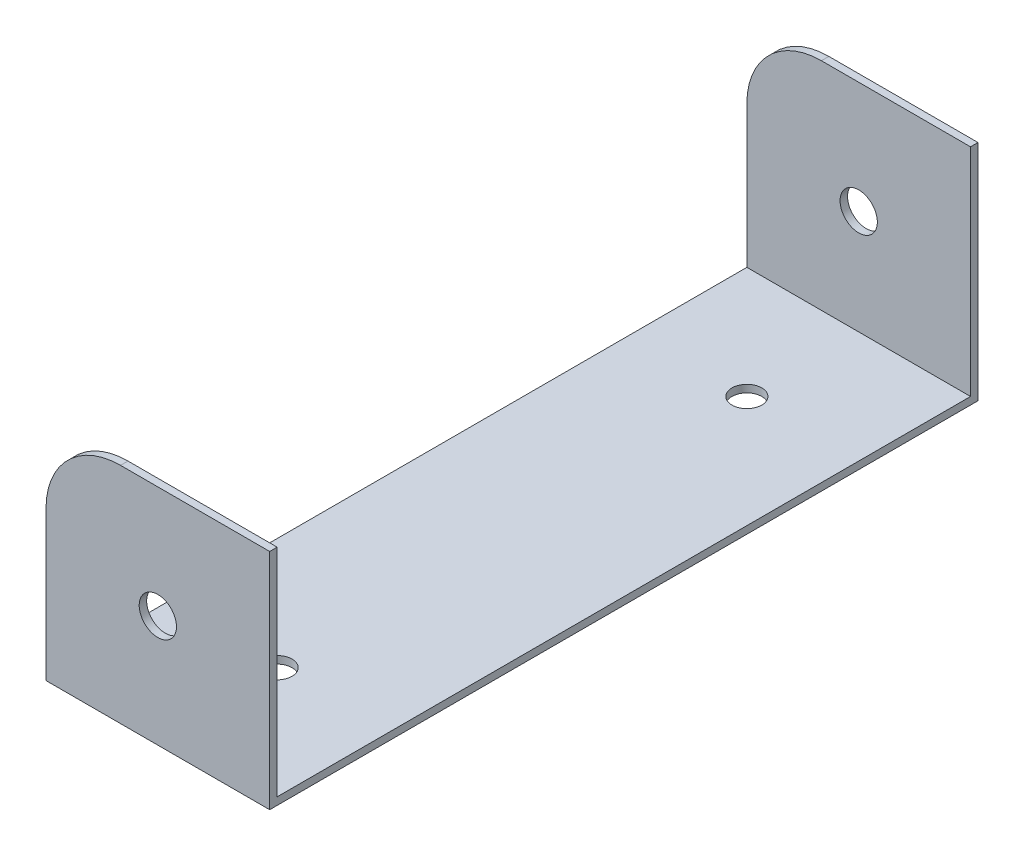
ISO-10303-21;
HEADER;
FILE_DESCRIPTION(('STEP AP214'),'2;1');
FILE_NAME('part.step','',(''),(''),'','','');
FILE_SCHEMA(('AUTOMOTIVE_DESIGN { 1 0 10303 214 1 1 1 1 }'));
ENDSEC;
DATA;
#1=APPLICATION_CONTEXT('core data for automotive mechanical design processes');
#2=APPLICATION_PROTOCOL_DEFINITION('international standard','automotive_design',2000,#1);
#3=PRODUCT_CONTEXT('',#1,'mechanical');
#4=PRODUCT('Part','Part','',(#3));
#5=PRODUCT_RELATED_PRODUCT_CATEGORY('part','',(#4));
#6=PRODUCT_DEFINITION_FORMATION('','',#4);
#7=PRODUCT_DEFINITION_CONTEXT('part definition',#1,'design');
#8=PRODUCT_DEFINITION('design','',#6,#7);
#9=PRODUCT_DEFINITION_SHAPE('','',#8);
#10=(LENGTH_UNIT() NAMED_UNIT(*) SI_UNIT(.MILLI.,.METRE.));
#11=(NAMED_UNIT(*) PLANE_ANGLE_UNIT() SI_UNIT($,.RADIAN.));
#12=(NAMED_UNIT(*) SI_UNIT($,.STERADIAN.) SOLID_ANGLE_UNIT());
#13=UNCERTAINTY_MEASURE_WITH_UNIT(LENGTH_MEASURE(1.E-05),#10,'distance_accuracy_value','');
#14=(GEOMETRIC_REPRESENTATION_CONTEXT(3) GLOBAL_UNCERTAINTY_ASSIGNED_CONTEXT((#13)) GLOBAL_UNIT_ASSIGNED_CONTEXT((#10,
#11,#12)) REPRESENTATION_CONTEXT('',''));
#15=CARTESIAN_POINT('',(0.,0.,0.));
#16=DIRECTION('',(0.,0.,1.));
#17=DIRECTION('',(1.,0.,0.));
#18=AXIS2_PLACEMENT_3D('',#15,#16,#17);
#19=CARTESIAN_POINT('',(0.,1.,0.));
#20=DIRECTION('',(0.,1.,0.));
#21=DIRECTION('',(0.,0.,1.));
#22=AXIS2_PLACEMENT_3D('',#19,#20,#21);
#23=PLANE('',#22);
#24=CARTESIAN_POINT('',(0.,1.,31.5));
#25=DIRECTION('',(0.,1.,0.));
#26=DIRECTION('',(0.,0.,-1.));
#27=AXIS2_PLACEMENT_3D('',#24,#25,#26);
#28=CIRCLE('',#27,2.);
#29=CARTESIAN_POINT('',(0.,1.,29.5));
#30=VERTEX_POINT('',#29);
#31=EDGE_CURVE('E226',#30,#30,#28,.T.);
#32=ORIENTED_EDGE('',*,*,#31,.F.);
#33=EDGE_LOOP('',(#32));
#34=FACE_BOUND('',#33,.T.);
#35=CARTESIAN_POINT('',(0.,1.,-31.5));
#36=DIRECTION('',(0.,1.,0.));
#37=DIRECTION('',(0.,0.,1.));
#38=AXIS2_PLACEMENT_3D('',#35,#36,#37);
#39=CIRCLE('',#38,2.);
#40=CARTESIAN_POINT('',(0.,1.,-29.5));
#41=VERTEX_POINT('',#40);
#42=EDGE_CURVE('E220',#41,#41,#39,.T.);
#43=ORIENTED_EDGE('',*,*,#42,.F.);
#44=EDGE_LOOP('',(#43));
#45=FACE_BOUND('',#44,.T.);
#46=DIRECTION('',(-1.,0.,0.));
#47=VECTOR('',#46,1.);
#48=CARTESIAN_POINT('',(-15.,1.,-46.5));
#49=LINE('',#48,#47);
#50=CARTESIAN_POINT('',(15.,1.,-46.5));
#51=VERTEX_POINT('',#50);
#52=CARTESIAN_POINT('',(-15.,1.,-46.5));
#53=VERTEX_POINT('',#52);
#54=EDGE_CURVE('E134',#51,#53,#49,.T.);
#55=ORIENTED_EDGE('',*,*,#54,.T.);
#56=DIRECTION('',(0.,0.,1.));
#57=VECTOR('',#56,1.);
#58=CARTESIAN_POINT('',(-15.,1.,47.5));
#59=LINE('',#58,#57);
#60=CARTESIAN_POINT('',(-15.,1.,46.5));
#61=VERTEX_POINT('',#60);
#62=EDGE_CURVE('E157',#53,#61,#59,.T.);
#63=ORIENTED_EDGE('',*,*,#62,.T.);
#64=DIRECTION('',(1.,0.,0.));
#65=VECTOR('',#64,1.);
#66=CARTESIAN_POINT('',(15.,1.,46.5));
#67=LINE('',#66,#65);
#68=CARTESIAN_POINT('',(15.,1.,46.5));
#69=VERTEX_POINT('',#68);
#70=EDGE_CURVE('E141',#61,#69,#67,.T.);
#71=ORIENTED_EDGE('',*,*,#70,.T.);
#72=DIRECTION('',(0.,0.,-1.));
#73=VECTOR('',#72,1.);
#74=CARTESIAN_POINT('',(15.,1.,47.5));
#75=LINE('',#74,#73);
#76=EDGE_CURVE('E160',#69,#51,#75,.T.);
#77=ORIENTED_EDGE('',*,*,#76,.T.);
#78=EDGE_LOOP('',(#55,#63,#71,#77));
#79=FACE_BOUND('',#78,.T.);
#80=ADVANCED_FACE('F32',(#34,#45,#79),#23,.T.);
#81=CARTESIAN_POINT('',(-15.,1.,47.5));
#82=DIRECTION('',(1.,0.,0.));
#83=DIRECTION('',(0.,0.,-1.));
#84=AXIS2_PLACEMENT_3D('',#81,#82,#83);
#85=PLANE('',#84);
#86=DIRECTION('',(0.,1.,0.));
#87=VECTOR('',#86,1.);
#88=CARTESIAN_POINT('',(-15.,30.,-46.5));
#89=LINE('',#88,#87);
#90=CARTESIAN_POINT('',(-15.,20.,-46.5));
#91=VERTEX_POINT('',#90);
#92=EDGE_CURVE('E120',#53,#91,#89,.T.);
#93=ORIENTED_EDGE('',*,*,#92,.T.);
#94=DIRECTION('',(0.,0.,-1.));
#95=VECTOR('',#94,1.);
#96=CARTESIAN_POINT('',(-15.,20.,-47.5));
#97=LINE('',#96,#95);
#98=CARTESIAN_POINT('',(-15.,20.,-47.5));
#99=VERTEX_POINT('',#98);
#100=EDGE_CURVE('E181',#91,#99,#97,.T.);
#101=ORIENTED_EDGE('',*,*,#100,.T.);
#102=DIRECTION('',(0.,-1.,0.));
#103=VECTOR('',#102,1.);
#104=CARTESIAN_POINT('',(-15.,1.,-47.5));
#105=LINE('',#104,#103);
#106=CARTESIAN_POINT('',(-15.,0.,-47.5));
#107=VERTEX_POINT('',#106);
#108=EDGE_CURVE('E163',#99,#107,#105,.T.);
#109=ORIENTED_EDGE('',*,*,#108,.T.);
#110=DIRECTION('',(0.,0.,1.));
#111=VECTOR('',#110,1.);
#112=CARTESIAN_POINT('',(-15.,0.,47.5));
#113=LINE('',#112,#111);
#114=CARTESIAN_POINT('',(-15.,0.,47.5));
#115=VERTEX_POINT('',#114);
#116=EDGE_CURVE('E156',#107,#115,#113,.T.);
#117=ORIENTED_EDGE('',*,*,#116,.T.);
#118=DIRECTION('',(0.,-1.,0.));
#119=VECTOR('',#118,1.);
#120=CARTESIAN_POINT('',(-15.,1.,47.5));
#121=LINE('',#120,#119);
#122=CARTESIAN_POINT('',(-15.,20.,47.5));
#123=VERTEX_POINT('',#122);
#124=EDGE_CURVE('E177',#123,#115,#121,.T.);
#125=ORIENTED_EDGE('',*,*,#124,.F.);
#126=DIRECTION('',(0.,0.,1.));
#127=VECTOR('',#126,1.);
#128=CARTESIAN_POINT('',(-15.,20.,46.5));
#129=LINE('',#128,#127);
#130=CARTESIAN_POINT('',(-15.,20.,46.5));
#131=VERTEX_POINT('',#130);
#132=EDGE_CURVE('E179',#123,#131,#129,.F.);
#133=ORIENTED_EDGE('',*,*,#132,.T.);
#134=DIRECTION('',(0.,-1.,0.));
#135=VECTOR('',#134,1.);
#136=CARTESIAN_POINT('',(-15.,1.,46.5));
#137=LINE('',#136,#135);
#138=EDGE_CURVE('E149',#131,#61,#137,.T.);
#139=ORIENTED_EDGE('',*,*,#138,.T.);
#140=ORIENTED_EDGE('',*,*,#62,.F.);
#141=EDGE_LOOP('',(#93,#101,#109,#117,#125,#133,#139,#140));
#142=FACE_BOUND('',#141,.T.);
#143=ADVANCED_FACE('F197',(#142),#85,.F.);
#144=CARTESIAN_POINT('',(15.,1.,47.5));
#145=DIRECTION('',(0.,0.,-1.));
#146=DIRECTION('',(-1.,0.,0.));
#147=AXIS2_PLACEMENT_3D('',#144,#145,#146);
#148=PLANE('',#147);
#149=CARTESIAN_POINT('',(0.,15.,47.5));
#150=DIRECTION('',(0.,0.,1.));
#151=DIRECTION('',(1.,0.,0.));
#152=AXIS2_PLACEMENT_3D('',#149,#150,#151);
#153=CIRCLE('',#152,2.5);
#154=CARTESIAN_POINT('',(2.5,15.,47.5));
#155=VERTEX_POINT('',#154);
#156=EDGE_CURVE('E214',#155,#155,#153,.T.);
#157=ORIENTED_EDGE('',*,*,#156,.F.);
#158=EDGE_LOOP('',(#157));
#159=FACE_BOUND('',#158,.T.);
#160=DIRECTION('',(-1.,0.,0.));
#161=VECTOR('',#160,1.);
#162=CARTESIAN_POINT('',(-15.,30.,47.5));
#163=LINE('',#162,#161);
#164=CARTESIAN_POINT('',(15.,30.,47.5));
#165=VERTEX_POINT('',#164);
#166=CARTESIAN_POINT('',(-4.99999999999999,30.,47.5));
#167=VERTEX_POINT('',#166);
#168=EDGE_CURVE('E129',#165,#167,#163,.T.);
#169=ORIENTED_EDGE('',*,*,#168,.T.);
#170=CARTESIAN_POINT('',(-4.99999999999999,20.,47.5));
#171=DIRECTION('',(0.,0.,-1.));
#172=DIRECTION('',(-1.,0.,0.));
#173=AXIS2_PLACEMENT_3D('',#170,#171,#172);
#174=CIRCLE('',#173,10.);
#175=EDGE_CURVE('E40',#167,#123,#174,.F.);
#176=ORIENTED_EDGE('',*,*,#175,.T.);
#177=ORIENTED_EDGE('',*,*,#124,.T.);
#178=DIRECTION('',(1.,0.,0.));
#179=VECTOR('',#178,1.);
#180=CARTESIAN_POINT('',(15.,0.,47.5));
#181=LINE('',#180,#179);
#182=CARTESIAN_POINT('',(15.,0.,47.5));
#183=VERTEX_POINT('',#182);
#184=EDGE_CURVE('E166',#115,#183,#181,.T.);
#185=ORIENTED_EDGE('',*,*,#184,.T.);
#186=DIRECTION('',(0.,-1.,0.));
#187=VECTOR('',#186,1.);
#188=CARTESIAN_POINT('',(15.,1.,47.5));
#189=LINE('',#188,#187);
#190=EDGE_CURVE('E174',#165,#183,#189,.T.);
#191=ORIENTED_EDGE('',*,*,#190,.F.);
#192=EDGE_LOOP('',(#169,#176,#177,#185,#191));
#193=FACE_BOUND('',#192,.T.);
#194=ADVANCED_FACE('F192',(#159,#193),#148,.F.);
#195=CARTESIAN_POINT('',(15.,1.,47.5));
#196=DIRECTION('',(-1.,0.,0.));
#197=DIRECTION('',(0.,0.,1.));
#198=AXIS2_PLACEMENT_3D('',#195,#196,#197);
#199=PLANE('',#198);
#200=DIRECTION('',(0.,0.,-1.));
#201=VECTOR('',#200,1.);
#202=CARTESIAN_POINT('',(15.,0.,47.5));
#203=LINE('',#202,#201);
#204=CARTESIAN_POINT('',(15.,0.,-47.5));
#205=VERTEX_POINT('',#204);
#206=EDGE_CURVE('E168',#183,#205,#203,.T.);
#207=ORIENTED_EDGE('',*,*,#206,.T.);
#208=DIRECTION('',(0.,-1.,0.));
#209=VECTOR('',#208,1.);
#210=CARTESIAN_POINT('',(15.,1.,-47.5));
#211=LINE('',#210,#209);
#212=CARTESIAN_POINT('',(15.,30.,-47.5));
#213=VERTEX_POINT('',#212);
#214=EDGE_CURVE('E128',#213,#205,#211,.T.);
#215=ORIENTED_EDGE('',*,*,#214,.F.);
#216=DIRECTION('',(0.,0.,-1.));
#217=VECTOR('',#216,1.);
#218=CARTESIAN_POINT('',(15.,30.,-46.5));
#219=LINE('',#218,#217);
#220=CARTESIAN_POINT('',(15.,30.,-46.5));
#221=VERTEX_POINT('',#220);
#222=EDGE_CURVE('E113',#221,#213,#219,.T.);
#223=ORIENTED_EDGE('',*,*,#222,.F.);
#224=DIRECTION('',(0.,-1.,0.));
#225=VECTOR('',#224,1.);
#226=CARTESIAN_POINT('',(15.,1.,-46.5));
#227=LINE('',#226,#225);
#228=EDGE_CURVE('E119',#221,#51,#227,.T.);
#229=ORIENTED_EDGE('',*,*,#228,.T.);
#230=ORIENTED_EDGE('',*,*,#76,.F.);
#231=DIRECTION('',(0.,1.,0.));
#232=VECTOR('',#231,1.);
#233=CARTESIAN_POINT('',(15.,30.,46.5));
#234=LINE('',#233,#232);
#235=CARTESIAN_POINT('',(15.,30.,46.5));
#236=VERTEX_POINT('',#235);
#237=EDGE_CURVE('E144',#69,#236,#234,.T.);
#238=ORIENTED_EDGE('',*,*,#237,.T.);
#239=DIRECTION('',(0.,0.,1.));
#240=VECTOR('',#239,1.);
#241=CARTESIAN_POINT('',(15.,30.,46.5));
#242=LINE('',#241,#240);
#243=EDGE_CURVE('E151',#236,#165,#242,.T.);
#244=ORIENTED_EDGE('',*,*,#243,.T.);
#245=ORIENTED_EDGE('',*,*,#190,.T.);
#246=EDGE_LOOP('',(#207,#215,#223,#229,#230,#238,#244,#245));
#247=FACE_BOUND('',#246,.T.);
#248=ADVANCED_FACE('F125',(#247),#199,.F.);
#249=CARTESIAN_POINT('',(15.,1.,-47.5));
#250=DIRECTION('',(0.,0.,1.));
#251=DIRECTION('',(1.,0.,0.));
#252=AXIS2_PLACEMENT_3D('',#249,#250,#251);
#253=PLANE('',#252);
#254=CARTESIAN_POINT('',(0.,15.,-47.5));
#255=DIRECTION('',(0.,0.,-1.));
#256=DIRECTION('',(-1.,0.,0.));
#257=AXIS2_PLACEMENT_3D('',#254,#255,#256);
#258=CIRCLE('',#257,2.5);
#259=CARTESIAN_POINT('',(-2.5,15.,-47.5));
#260=VERTEX_POINT('',#259);
#261=EDGE_CURVE('E208',#260,#260,#258,.T.);
#262=ORIENTED_EDGE('',*,*,#261,.F.);
#263=EDGE_LOOP('',(#262));
#264=FACE_BOUND('',#263,.T.);
#265=ORIENTED_EDGE('',*,*,#108,.F.);
#266=CARTESIAN_POINT('',(-4.99999999999999,20.,-47.5));
#267=DIRECTION('',(0.,0.,1.));
#268=DIRECTION('',(1.,0.,0.));
#269=AXIS2_PLACEMENT_3D('',#266,#267,#268);
#270=CIRCLE('',#269,10.);
#271=CARTESIAN_POINT('',(-4.99999999999998,30.,-47.5));
#272=VERTEX_POINT('',#271);
#273=EDGE_CURVE('E184',#99,#272,#270,.F.);
#274=ORIENTED_EDGE('',*,*,#273,.T.);
#275=DIRECTION('',(1.,0.,0.));
#276=VECTOR('',#275,1.);
#277=CARTESIAN_POINT('',(15.,30.,-47.5));
#278=LINE('',#277,#276);
#279=EDGE_CURVE('E138',#272,#213,#278,.T.);
#280=ORIENTED_EDGE('',*,*,#279,.T.);
#281=ORIENTED_EDGE('',*,*,#214,.T.);
#282=DIRECTION('',(-1.,0.,0.));
#283=VECTOR('',#282,1.);
#284=CARTESIAN_POINT('',(15.,0.,-47.5));
#285=LINE('',#284,#283);
#286=EDGE_CURVE('E161',#205,#107,#285,.T.);
#287=ORIENTED_EDGE('',*,*,#286,.T.);
#288=EDGE_LOOP('',(#265,#274,#280,#281,#287));
#289=FACE_BOUND('',#288,.T.);
#290=ADVANCED_FACE('F276',(#264,#289),#253,.F.);
#291=CARTESIAN_POINT('',(0.,0.,0.));
#292=DIRECTION('',(0.,1.,0.));
#293=DIRECTION('',(0.,0.,1.));
#294=AXIS2_PLACEMENT_3D('',#291,#292,#293);
#295=PLANE('',#294);
#296=CARTESIAN_POINT('',(0.,0.,31.5));
#297=DIRECTION('',(0.,1.,0.));
#298=DIRECTION('',(0.,0.,-1.));
#299=AXIS2_PLACEMENT_3D('',#296,#297,#298);
#300=CIRCLE('',#299,2.);
#301=CARTESIAN_POINT('',(0.,0.,29.5));
#302=VERTEX_POINT('',#301);
#303=EDGE_CURVE('E223',#302,#302,#300,.T.);
#304=ORIENTED_EDGE('',*,*,#303,.T.);
#305=EDGE_LOOP('',(#304));
#306=FACE_BOUND('',#305,.T.);
#307=CARTESIAN_POINT('',(0.,0.,-31.5));
#308=DIRECTION('',(0.,1.,0.));
#309=DIRECTION('',(0.,0.,1.));
#310=AXIS2_PLACEMENT_3D('',#307,#308,#309);
#311=CIRCLE('',#310,2.);
#312=CARTESIAN_POINT('',(0.,0.,-29.5));
#313=VERTEX_POINT('',#312);
#314=EDGE_CURVE('E217',#313,#313,#311,.T.);
#315=ORIENTED_EDGE('',*,*,#314,.T.);
#316=EDGE_LOOP('',(#315));
#317=FACE_BOUND('',#316,.T.);
#318=ORIENTED_EDGE('',*,*,#116,.F.);
#319=ORIENTED_EDGE('',*,*,#286,.F.);
#320=ORIENTED_EDGE('',*,*,#206,.F.);
#321=ORIENTED_EDGE('',*,*,#184,.F.);
#322=EDGE_LOOP('',(#318,#319,#320,#321));
#323=FACE_BOUND('',#322,.T.);
#324=ADVANCED_FACE('F232',(#306,#317,#323),#295,.F.);
#325=CARTESIAN_POINT('',(-15.,30.,46.5));
#326=DIRECTION('',(0.,1.,0.));
#327=DIRECTION('',(0.,0.,1.));
#328=AXIS2_PLACEMENT_3D('',#325,#326,#327);
#329=PLANE('',#328);
#330=DIRECTION('',(-1.,0.,0.));
#331=VECTOR('',#330,1.);
#332=CARTESIAN_POINT('',(-15.,30.,46.5));
#333=LINE('',#332,#331);
#334=CARTESIAN_POINT('',(-4.99999999999999,30.,46.5));
#335=VERTEX_POINT('',#334);
#336=EDGE_CURVE('E147',#236,#335,#333,.T.);
#337=ORIENTED_EDGE('',*,*,#336,.T.);
#338=DIRECTION('',(0.,0.,1.));
#339=VECTOR('',#338,1.);
#340=CARTESIAN_POINT('',(-4.99999999999999,30.,47.5));
#341=LINE('',#340,#339);
#342=EDGE_CURVE('E189',#335,#167,#341,.T.);
#343=ORIENTED_EDGE('',*,*,#342,.T.);
#344=ORIENTED_EDGE('',*,*,#168,.F.);
#345=ORIENTED_EDGE('',*,*,#243,.F.);
#346=EDGE_LOOP('',(#337,#343,#344,#345));
#347=FACE_BOUND('',#346,.T.);
#348=ADVANCED_FACE('F200',(#347),#329,.T.);
#349=CARTESIAN_POINT('',(0.,0.,46.5));
#350=DIRECTION('',(0.,0.,-1.));
#351=DIRECTION('',(-1.,0.,0.));
#352=AXIS2_PLACEMENT_3D('',#349,#350,#351);
#353=PLANE('',#352);
#354=CARTESIAN_POINT('',(0.,15.,46.5));
#355=DIRECTION('',(0.,0.,1.));
#356=DIRECTION('',(1.,0.,0.));
#357=AXIS2_PLACEMENT_3D('',#354,#355,#356);
#358=CIRCLE('',#357,2.5);
#359=CARTESIAN_POINT('',(2.5,15.,46.5));
#360=VERTEX_POINT('',#359);
#361=EDGE_CURVE('E211',#360,#360,#358,.T.);
#362=ORIENTED_EDGE('',*,*,#361,.T.);
#363=EDGE_LOOP('',(#362));
#364=FACE_BOUND('',#363,.T.);
#365=ORIENTED_EDGE('',*,*,#138,.F.);
#366=CARTESIAN_POINT('',(-4.99999999999999,20.,46.5));
#367=DIRECTION('',(0.,0.,-1.));
#368=DIRECTION('',(-1.,0.,0.));
#369=AXIS2_PLACEMENT_3D('',#366,#367,#368);
#370=CIRCLE('',#369,10.);
#371=EDGE_CURVE('E11',#131,#335,#370,.T.);
#372=ORIENTED_EDGE('',*,*,#371,.T.);
#373=ORIENTED_EDGE('',*,*,#336,.F.);
#374=ORIENTED_EDGE('',*,*,#237,.F.);
#375=ORIENTED_EDGE('',*,*,#70,.F.);
#376=EDGE_LOOP('',(#365,#372,#373,#374,#375));
#377=FACE_BOUND('',#376,.T.);
#378=ADVANCED_FACE('F201',(#364,#377),#353,.T.);
#379=CARTESIAN_POINT('',(15.,30.,-46.5));
#380=DIRECTION('',(0.,1.,0.));
#381=DIRECTION('',(0.,0.,1.));
#382=AXIS2_PLACEMENT_3D('',#379,#380,#381);
#383=PLANE('',#382);
#384=ORIENTED_EDGE('',*,*,#279,.F.);
#385=DIRECTION('',(0.,0.,-1.));
#386=VECTOR('',#385,1.);
#387=CARTESIAN_POINT('',(-4.99999999999999,30.,-46.5));
#388=LINE('',#387,#386);
#389=CARTESIAN_POINT('',(-4.99999999999998,30.,-46.5));
#390=VERTEX_POINT('',#389);
#391=EDGE_CURVE('E115',#272,#390,#388,.F.);
#392=ORIENTED_EDGE('',*,*,#391,.T.);
#393=DIRECTION('',(1.,0.,0.));
#394=VECTOR('',#393,1.);
#395=CARTESIAN_POINT('',(15.,30.,-46.5));
#396=LINE('',#395,#394);
#397=EDGE_CURVE('E109',#390,#221,#396,.T.);
#398=ORIENTED_EDGE('',*,*,#397,.T.);
#399=ORIENTED_EDGE('',*,*,#222,.T.);
#400=EDGE_LOOP('',(#384,#392,#398,#399));
#401=FACE_BOUND('',#400,.T.);
#402=ADVANCED_FACE('F112',(#401),#383,.T.);
#403=CARTESIAN_POINT('',(0.,0.,-46.5));
#404=DIRECTION('',(0.,0.,1.));
#405=DIRECTION('',(1.,0.,0.));
#406=AXIS2_PLACEMENT_3D('',#403,#404,#405);
#407=PLANE('',#406);
#408=CARTESIAN_POINT('',(0.,15.,-46.5));
#409=DIRECTION('',(0.,0.,-1.));
#410=DIRECTION('',(-1.,0.,0.));
#411=AXIS2_PLACEMENT_3D('',#408,#409,#410);
#412=CIRCLE('',#411,2.5);
#413=CARTESIAN_POINT('',(-2.5,15.,-46.5));
#414=VERTEX_POINT('',#413);
#415=EDGE_CURVE('E139',#414,#414,#412,.T.);
#416=ORIENTED_EDGE('',*,*,#415,.T.);
#417=EDGE_LOOP('',(#416));
#418=FACE_BOUND('',#417,.T.);
#419=ORIENTED_EDGE('',*,*,#397,.F.);
#420=CARTESIAN_POINT('',(-4.99999999999999,20.,-46.5));
#421=DIRECTION('',(0.,0.,1.));
#422=DIRECTION('',(1.,0.,0.));
#423=AXIS2_PLACEMENT_3D('',#420,#421,#422);
#424=CIRCLE('',#423,10.);
#425=EDGE_CURVE('E187',#390,#91,#424,.T.);
#426=ORIENTED_EDGE('',*,*,#425,.T.);
#427=ORIENTED_EDGE('',*,*,#92,.F.);
#428=ORIENTED_EDGE('',*,*,#54,.F.);
#429=ORIENTED_EDGE('',*,*,#228,.F.);
#430=EDGE_LOOP('',(#419,#426,#427,#428,#429));
#431=FACE_BOUND('',#430,.T.);
#432=ADVANCED_FACE('F132',(#418,#431),#407,.T.);
#433=CARTESIAN_POINT('',(0.,15.,-46.5));
#434=DIRECTION('',(0.,0.,-1.));
#435=DIRECTION('',(-1.,0.,0.));
#436=AXIS2_PLACEMENT_3D('',#433,#434,#435);
#437=CYLINDRICAL_SURFACE('',#436,2.5);
#438=ORIENTED_EDGE('',*,*,#415,.F.);
#439=EDGE_LOOP('',(#438));
#440=FACE_BOUND('',#439,.T.);
#441=ORIENTED_EDGE('',*,*,#261,.T.);
#442=EDGE_LOOP('',(#441));
#443=FACE_BOUND('',#442,.T.);
#444=ADVANCED_FACE('F259',(#440,#443),#437,.F.);
#445=CARTESIAN_POINT('',(0.,15.,46.5));
#446=DIRECTION('',(0.,0.,1.));
#447=DIRECTION('',(1.,0.,0.));
#448=AXIS2_PLACEMENT_3D('',#445,#446,#447);
#449=CYLINDRICAL_SURFACE('',#448,2.5);
#450=ORIENTED_EDGE('',*,*,#361,.F.);
#451=EDGE_LOOP('',(#450));
#452=FACE_BOUND('',#451,.T.);
#453=ORIENTED_EDGE('',*,*,#156,.T.);
#454=EDGE_LOOP('',(#453));
#455=FACE_BOUND('',#454,.T.);
#456=ADVANCED_FACE('F256',(#452,#455),#449,.F.);
#457=CARTESIAN_POINT('',(-4.99999999999999,20.,47.5));
#458=DIRECTION('',(0.,0.,1.));
#459=DIRECTION('',(1.,0.,0.));
#460=AXIS2_PLACEMENT_3D('',#457,#458,#459);
#461=CYLINDRICAL_SURFACE('',#460,10.);
#462=ORIENTED_EDGE('',*,*,#425,.F.);
#463=ORIENTED_EDGE('',*,*,#391,.F.);
#464=ORIENTED_EDGE('',*,*,#273,.F.);
#465=ORIENTED_EDGE('',*,*,#100,.F.);
#466=EDGE_LOOP('',(#462,#463,#464,#465));
#467=FACE_BOUND('',#466,.T.);
#468=ADVANCED_FACE('F253',(#467),#461,.T.);
#469=CARTESIAN_POINT('',(-4.99999999999999,20.,46.5));
#470=DIRECTION('',(0.,0.,-1.));
#471=DIRECTION('',(-1.,0.,0.));
#472=AXIS2_PLACEMENT_3D('',#469,#470,#471);
#473=CYLINDRICAL_SURFACE('',#472,10.);
#474=ORIENTED_EDGE('',*,*,#371,.F.);
#475=ORIENTED_EDGE('',*,*,#132,.F.);
#476=ORIENTED_EDGE('',*,*,#175,.F.);
#477=ORIENTED_EDGE('',*,*,#342,.F.);
#478=EDGE_LOOP('',(#474,#475,#476,#477));
#479=FACE_BOUND('',#478,.T.);
#480=ADVANCED_FACE('F34',(#479),#473,.T.);
#481=CARTESIAN_POINT('',(0.,0.,-31.5));
#482=DIRECTION('',(0.,1.,0.));
#483=DIRECTION('',(0.,0.,1.));
#484=AXIS2_PLACEMENT_3D('',#481,#482,#483);
#485=CYLINDRICAL_SURFACE('',#484,2.);
#486=ORIENTED_EDGE('',*,*,#314,.F.);
#487=EDGE_LOOP('',(#486));
#488=FACE_BOUND('',#487,.T.);
#489=ORIENTED_EDGE('',*,*,#42,.T.);
#490=EDGE_LOOP('',(#489));
#491=FACE_BOUND('',#490,.T.);
#492=ADVANCED_FACE('F238',(#488,#491),#485,.F.);
#493=CARTESIAN_POINT('',(0.,0.,31.5));
#494=DIRECTION('',(0.,1.,0.));
#495=DIRECTION('',(0.,0.,1.));
#496=AXIS2_PLACEMENT_3D('',#493,#494,#495);
#497=CYLINDRICAL_SURFACE('',#496,2.);
#498=ORIENTED_EDGE('',*,*,#303,.F.);
#499=EDGE_LOOP('',(#498));
#500=FACE_BOUND('',#499,.T.);
#501=ORIENTED_EDGE('',*,*,#31,.T.);
#502=EDGE_LOOP('',(#501));
#503=FACE_BOUND('',#502,.T.);
#504=ADVANCED_FACE('F235',(#500,#503),#497,.F.);
#505=CLOSED_SHELL('',(#80,#143,#194,#248,#290,#324,#348,#378,#402,#432,#444,#456,#468,#480,#492,#504));
#506=MANIFOLD_SOLID_BREP('B2',#505);
#507=ADVANCED_BREP_SHAPE_REPRESENTATION('',(#18,#506),#14);
#508=SHAPE_DEFINITION_REPRESENTATION(#9,#507);
ENDSEC;
END-ISO-10303-21;
